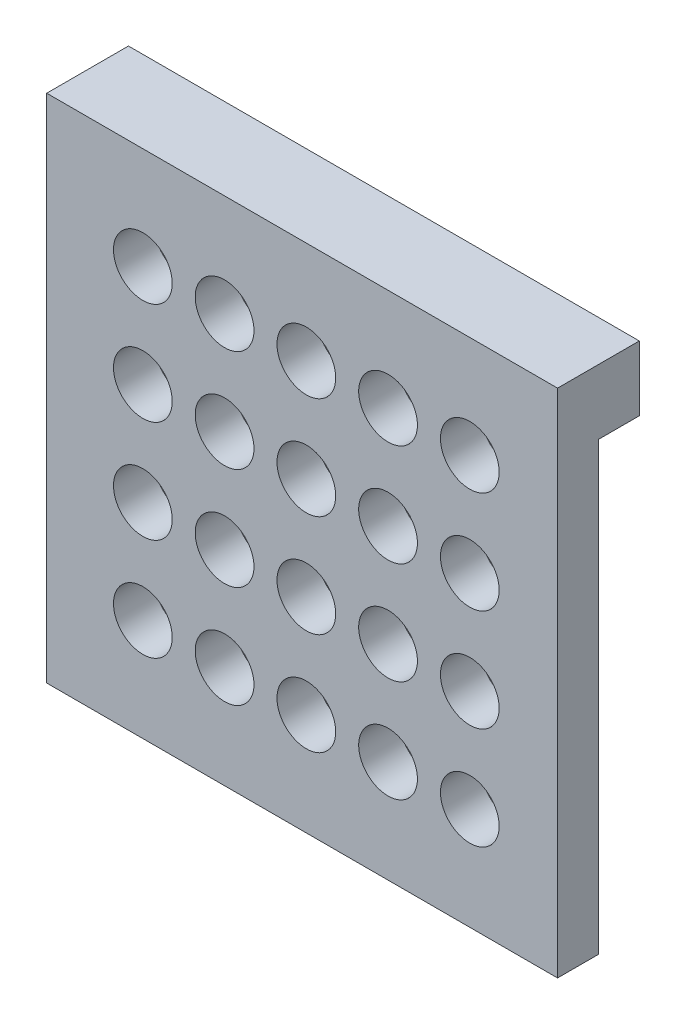
ISO-10303-21;
HEADER;
FILE_DESCRIPTION(('STEP AP214'),'2;1');
FILE_NAME('part.step','',(''),(''),'','','');
FILE_SCHEMA(('AUTOMOTIVE_DESIGN { 1 0 10303 214 1 1 1 1 }'));
ENDSEC;
DATA;
#1=APPLICATION_CONTEXT('core data for automotive mechanical design processes');
#2=APPLICATION_PROTOCOL_DEFINITION('international standard','automotive_design',2000,#1);
#3=PRODUCT_CONTEXT('',#1,'mechanical');
#4=PRODUCT('Part','Part','',(#3));
#5=PRODUCT_RELATED_PRODUCT_CATEGORY('part','',(#4));
#6=PRODUCT_DEFINITION_FORMATION('','',#4);
#7=PRODUCT_DEFINITION_CONTEXT('part definition',#1,'design');
#8=PRODUCT_DEFINITION('design','',#6,#7);
#9=PRODUCT_DEFINITION_SHAPE('','',#8);
#10=(LENGTH_UNIT() NAMED_UNIT(*) SI_UNIT(.MILLI.,.METRE.));
#11=(NAMED_UNIT(*) PLANE_ANGLE_UNIT() SI_UNIT($,.RADIAN.));
#12=(NAMED_UNIT(*) SI_UNIT($,.STERADIAN.) SOLID_ANGLE_UNIT());
#13=UNCERTAINTY_MEASURE_WITH_UNIT(LENGTH_MEASURE(1.E-05),#10,'distance_accuracy_value','');
#14=(GEOMETRIC_REPRESENTATION_CONTEXT(3) GLOBAL_UNCERTAINTY_ASSIGNED_CONTEXT((#13)) GLOBAL_UNIT_ASSIGNED_CONTEXT((#10,
#11,#12)) REPRESENTATION_CONTEXT('',''));
#15=CARTESIAN_POINT('',(0.,0.,0.));
#16=DIRECTION('',(0.,0.,1.));
#17=DIRECTION('',(1.,0.,0.));
#18=AXIS2_PLACEMENT_3D('',#15,#16,#17);
#19=CARTESIAN_POINT('',(0.,0.,4.));
#20=DIRECTION('',(1.,0.,0.));
#21=DIRECTION('',(0.,0.,-1.));
#22=AXIS2_PLACEMENT_3D('',#19,#20,#21);
#23=PLANE('',#22);
#24=DIRECTION('',(0.,0.,-1.));
#25=VECTOR('',#24,1.);
#26=CARTESIAN_POINT('',(0.,50.,4.));
#27=LINE('',#26,#25);
#28=CARTESIAN_POINT('',(0.,50.,4.));
#29=VERTEX_POINT('',#28);
#30=CARTESIAN_POINT('',(0.,50.,-4.));
#31=VERTEX_POINT('',#30);
#32=EDGE_CURVE('E246',#29,#31,#27,.T.);
#33=ORIENTED_EDGE('',*,*,#32,.T.);
#34=DIRECTION('',(0.,1.,0.));
#35=VECTOR('',#34,1.);
#36=CARTESIAN_POINT('',(0.,50.,-4.));
#37=LINE('',#36,#35);
#38=CARTESIAN_POINT('',(0.,43.6517328811306,-4.));
#39=VERTEX_POINT('',#38);
#40=EDGE_CURVE('E102',#39,#31,#37,.T.);
#41=ORIENTED_EDGE('',*,*,#40,.F.);
#42=DIRECTION('',(0.,0.,1.));
#43=VECTOR('',#42,1.);
#44=CARTESIAN_POINT('',(0.,43.6517328811306,-4.));
#45=LINE('',#44,#43);
#46=CARTESIAN_POINT('',(0.,43.6517328811306,0.));
#47=VERTEX_POINT('',#46);
#48=EDGE_CURVE('E98',#39,#47,#45,.T.);
#49=ORIENTED_EDGE('',*,*,#48,.T.);
#50=DIRECTION('',(0.,-1.,0.));
#51=VECTOR('',#50,1.);
#52=CARTESIAN_POINT('',(0.,0.,0.));
#53=LINE('',#52,#51);
#54=CARTESIAN_POINT('',(0.,0.,0.));
#55=VERTEX_POINT('',#54);
#56=EDGE_CURVE('E237',#47,#55,#53,.T.);
#57=ORIENTED_EDGE('',*,*,#56,.T.);
#58=DIRECTION('',(0.,0.,-1.));
#59=VECTOR('',#58,1.);
#60=CARTESIAN_POINT('',(0.,0.,4.));
#61=LINE('',#60,#59);
#62=CARTESIAN_POINT('',(0.,0.,4.));
#63=VERTEX_POINT('',#62);
#64=EDGE_CURVE('E11',#63,#55,#61,.T.);
#65=ORIENTED_EDGE('',*,*,#64,.F.);
#66=DIRECTION('',(0.,-1.,0.));
#67=VECTOR('',#66,1.);
#68=CARTESIAN_POINT('',(0.,0.,4.));
#69=LINE('',#68,#67);
#70=EDGE_CURVE('E240',#29,#63,#69,.T.);
#71=ORIENTED_EDGE('',*,*,#70,.F.);
#72=EDGE_LOOP('',(#33,#41,#49,#57,#65,#71));
#73=FACE_BOUND('',#72,.T.);
#74=ADVANCED_FACE('F32',(#73),#23,.F.);
#75=CARTESIAN_POINT('',(0.,0.,4.));
#76=DIRECTION('',(0.,1.,0.));
#77=DIRECTION('',(0.,0.,1.));
#78=AXIS2_PLACEMENT_3D('',#75,#76,#77);
#79=PLANE('',#78);
#80=DIRECTION('',(1.,0.,0.));
#81=VECTOR('',#80,1.);
#82=CARTESIAN_POINT('',(0.,0.,0.));
#83=LINE('',#82,#81);
#84=CARTESIAN_POINT('',(50.,0.,0.));
#85=VERTEX_POINT('',#84);
#86=EDGE_CURVE('E70',#55,#85,#83,.T.);
#87=ORIENTED_EDGE('',*,*,#86,.T.);
#88=DIRECTION('',(0.,0.,-1.));
#89=VECTOR('',#88,1.);
#90=CARTESIAN_POINT('',(50.,0.,4.));
#91=LINE('',#90,#89);
#92=CARTESIAN_POINT('',(50.,0.,4.));
#93=VERTEX_POINT('',#92);
#94=EDGE_CURVE('E39',#93,#85,#91,.T.);
#95=ORIENTED_EDGE('',*,*,#94,.F.);
#96=DIRECTION('',(1.,0.,0.));
#97=VECTOR('',#96,1.);
#98=CARTESIAN_POINT('',(0.,0.,4.));
#99=LINE('',#98,#97);
#100=EDGE_CURVE('E75',#63,#93,#99,.T.);
#101=ORIENTED_EDGE('',*,*,#100,.F.);
#102=ORIENTED_EDGE('',*,*,#64,.T.);
#103=EDGE_LOOP('',(#87,#95,#101,#102));
#104=FACE_BOUND('',#103,.T.);
#105=ADVANCED_FACE('F256',(#104),#79,.F.);
#106=CARTESIAN_POINT('',(50.,0.,4.));
#107=DIRECTION('',(-1.,0.,0.));
#108=DIRECTION('',(0.,0.,1.));
#109=AXIS2_PLACEMENT_3D('',#106,#107,#108);
#110=PLANE('',#109);
#111=DIRECTION('',(0.,1.,0.));
#112=VECTOR('',#111,1.);
#113=CARTESIAN_POINT('',(50.,0.,0.));
#114=LINE('',#113,#112);
#115=CARTESIAN_POINT('',(50.,43.6517328811306,0.));
#116=VERTEX_POINT('',#115);
#117=EDGE_CURVE('E114',#85,#116,#114,.T.);
#118=ORIENTED_EDGE('',*,*,#117,.T.);
#119=DIRECTION('',(0.,0.,1.));
#120=VECTOR('',#119,1.);
#121=CARTESIAN_POINT('',(50.,43.6517328811306,-4.));
#122=LINE('',#121,#120);
#123=CARTESIAN_POINT('',(50.,43.6517328811306,-4.));
#124=VERTEX_POINT('',#123);
#125=EDGE_CURVE('E96',#124,#116,#122,.T.);
#126=ORIENTED_EDGE('',*,*,#125,.F.);
#127=DIRECTION('',(0.,-1.,0.));
#128=VECTOR('',#127,1.);
#129=CARTESIAN_POINT('',(50.,50.,-4.));
#130=LINE('',#129,#128);
#131=CARTESIAN_POINT('',(50.,50.,-4.));
#132=VERTEX_POINT('',#131);
#133=EDGE_CURVE('E103',#132,#124,#130,.T.);
#134=ORIENTED_EDGE('',*,*,#133,.F.);
#135=DIRECTION('',(0.,0.,-1.));
#136=VECTOR('',#135,1.);
#137=CARTESIAN_POINT('',(50.,50.,4.));
#138=LINE('',#137,#136);
#139=CARTESIAN_POINT('',(50.,50.,4.));
#140=VERTEX_POINT('',#139);
#141=EDGE_CURVE('E251',#140,#132,#138,.T.);
#142=ORIENTED_EDGE('',*,*,#141,.F.);
#143=DIRECTION('',(0.,1.,0.));
#144=VECTOR('',#143,1.);
#145=CARTESIAN_POINT('',(50.,0.,4.));
#146=LINE('',#145,#144);
#147=EDGE_CURVE('E243',#93,#140,#146,.T.);
#148=ORIENTED_EDGE('',*,*,#147,.F.);
#149=ORIENTED_EDGE('',*,*,#94,.T.);
#150=EDGE_LOOP('',(#118,#126,#134,#142,#148,#149));
#151=FACE_BOUND('',#150,.T.);
#152=ADVANCED_FACE('F113',(#151),#110,.F.);
#153=CARTESIAN_POINT('',(0.,50.,4.));
#154=DIRECTION('',(0.,-1.,0.));
#155=DIRECTION('',(0.,0.,-1.));
#156=AXIS2_PLACEMENT_3D('',#153,#154,#155);
#157=PLANE('',#156);
#158=ORIENTED_EDGE('',*,*,#141,.T.);
#159=DIRECTION('',(1.,0.,0.));
#160=VECTOR('',#159,1.);
#161=CARTESIAN_POINT('',(50.,50.,-4.));
#162=LINE('',#161,#160);
#163=EDGE_CURVE('E109',#31,#132,#162,.T.);
#164=ORIENTED_EDGE('',*,*,#163,.F.);
#165=ORIENTED_EDGE('',*,*,#32,.F.);
#166=DIRECTION('',(-1.,0.,0.));
#167=VECTOR('',#166,1.);
#168=CARTESIAN_POINT('',(0.,50.,4.));
#169=LINE('',#168,#167);
#170=EDGE_CURVE('E55',#140,#29,#169,.T.);
#171=ORIENTED_EDGE('',*,*,#170,.F.);
#172=EDGE_LOOP('',(#158,#164,#165,#171));
#173=FACE_BOUND('',#172,.T.);
#174=ADVANCED_FACE('F262',(#173),#157,.F.);
#175=CARTESIAN_POINT('',(0.,0.,4.));
#176=DIRECTION('',(0.,0.,-1.));
#177=DIRECTION('',(-1.,0.,0.));
#178=AXIS2_PLACEMENT_3D('',#175,#176,#177);
#179=PLANE('',#178);
#180=CARTESIAN_POINT('',(9.41089603938606,10.0097791512671,4.));
#181=DIRECTION('',(0.,0.,1.));
#182=DIRECTION('',(1.,0.,0.));
#183=AXIS2_PLACEMENT_3D('',#180,#181,#182);
#184=CIRCLE('',#183,2.87499818107141);
#185=CARTESIAN_POINT('',(12.2858942204575,10.0097791512671,4.));
#186=VERTEX_POINT('',#185);
#187=EDGE_CURVE('E115',#186,#186,#184,.T.);
#188=ORIENTED_EDGE('',*,*,#187,.F.);
#189=EDGE_LOOP('',(#188));
#190=FACE_BOUND('',#189,.T.);
#191=CARTESIAN_POINT('',(9.41089603938596,20.0097791512671,4.));
#192=DIRECTION('',(0.,0.,1.));
#193=DIRECTION('',(1.,0.,0.));
#194=AXIS2_PLACEMENT_3D('',#191,#192,#193);
#195=CIRCLE('',#194,2.87499818107141);
#196=CARTESIAN_POINT('',(12.2858942204574,20.0097791512671,4.));
#197=VERTEX_POINT('',#196);
#198=EDGE_CURVE('E229',#197,#197,#195,.T.);
#199=ORIENTED_EDGE('',*,*,#198,.F.);
#200=EDGE_LOOP('',(#199));
#201=FACE_BOUND('',#200,.T.);
#202=CARTESIAN_POINT('',(9.41089603938585,30.0097791512671,4.));
#203=DIRECTION('',(0.,0.,1.));
#204=DIRECTION('',(1.,0.,0.));
#205=AXIS2_PLACEMENT_3D('',#202,#203,#204);
#206=CIRCLE('',#205,2.87499818107141);
#207=CARTESIAN_POINT('',(12.2858942204573,30.0097791512671,4.));
#208=VERTEX_POINT('',#207);
#209=EDGE_CURVE('E223',#208,#208,#206,.T.);
#210=ORIENTED_EDGE('',*,*,#209,.F.);
#211=EDGE_LOOP('',(#210));
#212=FACE_BOUND('',#211,.T.);
#213=CARTESIAN_POINT('',(41.4108960393861,10.0097791512671,4.));
#214=DIRECTION('',(0.,0.,1.));
#215=DIRECTION('',(1.,0.,0.));
#216=AXIS2_PLACEMENT_3D('',#213,#214,#215);
#217=CIRCLE('',#216,2.87499818107141);
#218=CARTESIAN_POINT('',(44.2858942204575,10.0097791512671,4.));
#219=VERTEX_POINT('',#218);
#220=EDGE_CURVE('E217',#219,#219,#217,.T.);
#221=ORIENTED_EDGE('',*,*,#220,.F.);
#222=EDGE_LOOP('',(#221));
#223=FACE_BOUND('',#222,.T.);
#224=CARTESIAN_POINT('',(33.4108960393861,10.0097791512671,4.));
#225=DIRECTION('',(0.,0.,1.));
#226=DIRECTION('',(1.,0.,0.));
#227=AXIS2_PLACEMENT_3D('',#224,#225,#226);
#228=CIRCLE('',#227,2.87499818107141);
#229=CARTESIAN_POINT('',(36.2858942204575,10.0097791512671,4.));
#230=VERTEX_POINT('',#229);
#231=EDGE_CURVE('E211',#230,#230,#228,.T.);
#232=ORIENTED_EDGE('',*,*,#231,.F.);
#233=EDGE_LOOP('',(#232));
#234=FACE_BOUND('',#233,.T.);
#235=CARTESIAN_POINT('',(25.4108960393861,10.0097791512671,4.));
#236=DIRECTION('',(0.,0.,1.));
#237=DIRECTION('',(1.,0.,0.));
#238=AXIS2_PLACEMENT_3D('',#235,#236,#237);
#239=CIRCLE('',#238,2.87499818107141);
#240=CARTESIAN_POINT('',(28.2858942204575,10.0097791512671,4.));
#241=VERTEX_POINT('',#240);
#242=EDGE_CURVE('E205',#241,#241,#239,.T.);
#243=ORIENTED_EDGE('',*,*,#242,.F.);
#244=EDGE_LOOP('',(#243));
#245=FACE_BOUND('',#244,.T.);
#246=CARTESIAN_POINT('',(17.4108960393861,10.0097791512671,4.));
#247=DIRECTION('',(0.,0.,1.));
#248=DIRECTION('',(1.,0.,0.));
#249=AXIS2_PLACEMENT_3D('',#246,#247,#248);
#250=CIRCLE('',#249,2.87499818107141);
#251=CARTESIAN_POINT('',(20.2858942204575,10.0097791512671,4.));
#252=VERTEX_POINT('',#251);
#253=EDGE_CURVE('E199',#252,#252,#250,.T.);
#254=ORIENTED_EDGE('',*,*,#253,.F.);
#255=EDGE_LOOP('',(#254));
#256=FACE_BOUND('',#255,.T.);
#257=CARTESIAN_POINT('',(41.410896039386,20.0097791512671,4.));
#258=DIRECTION('',(0.,0.,1.));
#259=DIRECTION('',(1.,0.,0.));
#260=AXIS2_PLACEMENT_3D('',#257,#258,#259);
#261=CIRCLE('',#260,2.87499818107141);
#262=CARTESIAN_POINT('',(44.2858942204574,20.0097791512671,4.));
#263=VERTEX_POINT('',#262);
#264=EDGE_CURVE('E193',#263,#263,#261,.T.);
#265=ORIENTED_EDGE('',*,*,#264,.F.);
#266=EDGE_LOOP('',(#265));
#267=FACE_BOUND('',#266,.T.);
#268=CARTESIAN_POINT('',(33.410896039386,20.0097791512671,4.));
#269=DIRECTION('',(0.,0.,1.));
#270=DIRECTION('',(1.,0.,0.));
#271=AXIS2_PLACEMENT_3D('',#268,#269,#270);
#272=CIRCLE('',#271,2.87499818107141);
#273=CARTESIAN_POINT('',(36.2858942204574,20.0097791512671,4.));
#274=VERTEX_POINT('',#273);
#275=EDGE_CURVE('E187',#274,#274,#272,.T.);
#276=ORIENTED_EDGE('',*,*,#275,.F.);
#277=EDGE_LOOP('',(#276));
#278=FACE_BOUND('',#277,.T.);
#279=CARTESIAN_POINT('',(25.410896039386,20.0097791512671,4.));
#280=DIRECTION('',(0.,0.,1.));
#281=DIRECTION('',(1.,0.,0.));
#282=AXIS2_PLACEMENT_3D('',#279,#280,#281);
#283=CIRCLE('',#282,2.87499818107141);
#284=CARTESIAN_POINT('',(28.2858942204574,20.0097791512671,4.));
#285=VERTEX_POINT('',#284);
#286=EDGE_CURVE('E181',#285,#285,#283,.T.);
#287=ORIENTED_EDGE('',*,*,#286,.F.);
#288=EDGE_LOOP('',(#287));
#289=FACE_BOUND('',#288,.T.);
#290=CARTESIAN_POINT('',(17.410896039386,20.0097791512671,4.));
#291=DIRECTION('',(0.,0.,1.));
#292=DIRECTION('',(1.,0.,0.));
#293=AXIS2_PLACEMENT_3D('',#290,#291,#292);
#294=CIRCLE('',#293,2.87499818107141);
#295=CARTESIAN_POINT('',(20.2858942204574,20.0097791512671,4.));
#296=VERTEX_POINT('',#295);
#297=EDGE_CURVE('E175',#296,#296,#294,.T.);
#298=ORIENTED_EDGE('',*,*,#297,.F.);
#299=EDGE_LOOP('',(#298));
#300=FACE_BOUND('',#299,.T.);
#301=CARTESIAN_POINT('',(41.4108960393859,30.0097791512671,4.));
#302=DIRECTION('',(0.,0.,1.));
#303=DIRECTION('',(1.,0.,0.));
#304=AXIS2_PLACEMENT_3D('',#301,#302,#303);
#305=CIRCLE('',#304,2.87499818107141);
#306=CARTESIAN_POINT('',(44.2858942204573,30.0097791512671,4.));
#307=VERTEX_POINT('',#306);
#308=EDGE_CURVE('E169',#307,#307,#305,.T.);
#309=ORIENTED_EDGE('',*,*,#308,.F.);
#310=EDGE_LOOP('',(#309));
#311=FACE_BOUND('',#310,.T.);
#312=CARTESIAN_POINT('',(33.4108960393859,30.0097791512671,4.));
#313=DIRECTION('',(0.,0.,1.));
#314=DIRECTION('',(1.,0.,0.));
#315=AXIS2_PLACEMENT_3D('',#312,#313,#314);
#316=CIRCLE('',#315,2.87499818107141);
#317=CARTESIAN_POINT('',(36.2858942204573,30.0097791512671,4.));
#318=VERTEX_POINT('',#317);
#319=EDGE_CURVE('E163',#318,#318,#316,.T.);
#320=ORIENTED_EDGE('',*,*,#319,.F.);
#321=EDGE_LOOP('',(#320));
#322=FACE_BOUND('',#321,.T.);
#323=CARTESIAN_POINT('',(25.4108960393859,30.0097791512671,4.));
#324=DIRECTION('',(0.,0.,1.));
#325=DIRECTION('',(1.,0.,0.));
#326=AXIS2_PLACEMENT_3D('',#323,#324,#325);
#327=CIRCLE('',#326,2.87499818107141);
#328=CARTESIAN_POINT('',(28.2858942204573,30.0097791512671,4.));
#329=VERTEX_POINT('',#328);
#330=EDGE_CURVE('E157',#329,#329,#327,.T.);
#331=ORIENTED_EDGE('',*,*,#330,.F.);
#332=EDGE_LOOP('',(#331));
#333=FACE_BOUND('',#332,.T.);
#334=CARTESIAN_POINT('',(17.4108960393859,30.0097791512671,4.));
#335=DIRECTION('',(0.,0.,1.));
#336=DIRECTION('',(1.,0.,0.));
#337=AXIS2_PLACEMENT_3D('',#334,#335,#336);
#338=CIRCLE('',#337,2.87499818107141);
#339=CARTESIAN_POINT('',(20.2858942204573,30.0097791512671,4.));
#340=VERTEX_POINT('',#339);
#341=EDGE_CURVE('E151',#340,#340,#338,.T.);
#342=ORIENTED_EDGE('',*,*,#341,.F.);
#343=EDGE_LOOP('',(#342));
#344=FACE_BOUND('',#343,.T.);
#345=CARTESIAN_POINT('',(41.4108960393857,40.0097791512671,4.));
#346=DIRECTION('',(0.,0.,1.));
#347=DIRECTION('',(1.,0.,0.));
#348=AXIS2_PLACEMENT_3D('',#345,#346,#347);
#349=CIRCLE('',#348,2.87499818107141);
#350=CARTESIAN_POINT('',(44.2858942204572,40.0097791512671,4.));
#351=VERTEX_POINT('',#350);
#352=EDGE_CURVE('E145',#351,#351,#349,.T.);
#353=ORIENTED_EDGE('',*,*,#352,.F.);
#354=EDGE_LOOP('',(#353));
#355=FACE_BOUND('',#354,.T.);
#356=CARTESIAN_POINT('',(33.4108960393857,40.0097791512671,4.));
#357=DIRECTION('',(0.,0.,1.));
#358=DIRECTION('',(1.,0.,0.));
#359=AXIS2_PLACEMENT_3D('',#356,#357,#358);
#360=CIRCLE('',#359,2.87499818107141);
#361=CARTESIAN_POINT('',(36.2858942204572,40.0097791512671,4.));
#362=VERTEX_POINT('',#361);
#363=EDGE_CURVE('E139',#362,#362,#360,.T.);
#364=ORIENTED_EDGE('',*,*,#363,.F.);
#365=EDGE_LOOP('',(#364));
#366=FACE_BOUND('',#365,.T.);
#367=CARTESIAN_POINT('',(25.4108960393857,40.0097791512671,4.));
#368=DIRECTION('',(0.,0.,1.));
#369=DIRECTION('',(1.,0.,0.));
#370=AXIS2_PLACEMENT_3D('',#367,#368,#369);
#371=CIRCLE('',#370,2.87499818107141);
#372=CARTESIAN_POINT('',(28.2858942204572,40.0097791512671,4.));
#373=VERTEX_POINT('',#372);
#374=EDGE_CURVE('E133',#373,#373,#371,.T.);
#375=ORIENTED_EDGE('',*,*,#374,.F.);
#376=EDGE_LOOP('',(#375));
#377=FACE_BOUND('',#376,.T.);
#378=CARTESIAN_POINT('',(17.4108960393857,40.0097791512671,4.));
#379=DIRECTION('',(0.,0.,1.));
#380=DIRECTION('',(1.,0.,0.));
#381=AXIS2_PLACEMENT_3D('',#378,#379,#380);
#382=CIRCLE('',#381,2.87499818107141);
#383=CARTESIAN_POINT('',(20.2858942204572,40.0097791512671,4.));
#384=VERTEX_POINT('',#383);
#385=EDGE_CURVE('E127',#384,#384,#382,.T.);
#386=ORIENTED_EDGE('',*,*,#385,.F.);
#387=EDGE_LOOP('',(#386));
#388=FACE_BOUND('',#387,.T.);
#389=CARTESIAN_POINT('',(9.41089603938575,40.0097791512671,4.));
#390=DIRECTION('',(0.,0.,1.));
#391=DIRECTION('',(1.,0.,0.));
#392=AXIS2_PLACEMENT_3D('',#389,#390,#391);
#393=CIRCLE('',#392,2.87499818107141);
#394=CARTESIAN_POINT('',(12.2858942204572,40.0097791512671,4.));
#395=VERTEX_POINT('',#394);
#396=EDGE_CURVE('E126',#395,#395,#393,.T.);
#397=ORIENTED_EDGE('',*,*,#396,.F.);
#398=EDGE_LOOP('',(#397));
#399=FACE_BOUND('',#398,.T.);
#400=ORIENTED_EDGE('',*,*,#70,.T.);
#401=ORIENTED_EDGE('',*,*,#100,.T.);
#402=ORIENTED_EDGE('',*,*,#147,.T.);
#403=ORIENTED_EDGE('',*,*,#170,.T.);
#404=EDGE_LOOP('',(#400,#401,#402,#403));
#405=FACE_BOUND('',#404,.T.);
#406=ADVANCED_FACE('F264',(#190,#201,#212,#223,#234,#245,#256,#267,#278,#289,#300,#311,#322,
#333,#344,#355,#366,#377,#388,#399,#405),#179,.F.);
#407=CARTESIAN_POINT('',(0.,0.,0.));
#408=DIRECTION('',(0.,0.,-1.));
#409=DIRECTION('',(-1.,0.,0.));
#410=AXIS2_PLACEMENT_3D('',#407,#408,#409);
#411=PLANE('',#410);
#412=DIRECTION('',(-1.,0.,0.));
#413=VECTOR('',#412,1.);
#414=CARTESIAN_POINT('',(50.,43.6517328811306,0.));
#415=LINE('',#414,#413);
#416=EDGE_CURVE('E46',#116,#47,#415,.T.);
#417=ORIENTED_EDGE('',*,*,#416,.F.);
#418=ORIENTED_EDGE('',*,*,#117,.F.);
#419=ORIENTED_EDGE('',*,*,#86,.F.);
#420=ORIENTED_EDGE('',*,*,#56,.F.);
#421=EDGE_LOOP('',(#417,#418,#419,#420));
#422=FACE_BOUND('',#421,.T.);
#423=CARTESIAN_POINT('',(9.41089603938606,10.0097791512671,0.));
#424=DIRECTION('',(0.,0.,1.));
#425=DIRECTION('',(1.,0.,0.));
#426=AXIS2_PLACEMENT_3D('',#423,#424,#425);
#427=CIRCLE('',#426,2.87499818107141);
#428=CARTESIAN_POINT('',(12.2858942204575,10.0097791512671,0.));
#429=VERTEX_POINT('',#428);
#430=EDGE_CURVE('E118',#429,#429,#427,.T.);
#431=ORIENTED_EDGE('',*,*,#430,.T.);
#432=EDGE_LOOP('',(#431));
#433=FACE_BOUND('',#432,.T.);
#434=CARTESIAN_POINT('',(9.41089603938596,20.0097791512671,0.));
#435=DIRECTION('',(0.,0.,1.));
#436=DIRECTION('',(1.,0.,0.));
#437=AXIS2_PLACEMENT_3D('',#434,#435,#436);
#438=CIRCLE('',#437,2.87499818107141);
#439=CARTESIAN_POINT('',(12.2858942204574,20.0097791512671,0.));
#440=VERTEX_POINT('',#439);
#441=EDGE_CURVE('E226',#440,#440,#438,.T.);
#442=ORIENTED_EDGE('',*,*,#441,.T.);
#443=EDGE_LOOP('',(#442));
#444=FACE_BOUND('',#443,.T.);
#445=CARTESIAN_POINT('',(9.41089603938585,30.0097791512671,0.));
#446=DIRECTION('',(0.,0.,1.));
#447=DIRECTION('',(1.,0.,0.));
#448=AXIS2_PLACEMENT_3D('',#445,#446,#447);
#449=CIRCLE('',#448,2.87499818107141);
#450=CARTESIAN_POINT('',(12.2858942204573,30.0097791512671,0.));
#451=VERTEX_POINT('',#450);
#452=EDGE_CURVE('E220',#451,#451,#449,.T.);
#453=ORIENTED_EDGE('',*,*,#452,.T.);
#454=EDGE_LOOP('',(#453));
#455=FACE_BOUND('',#454,.T.);
#456=CARTESIAN_POINT('',(41.4108960393861,10.0097791512671,0.));
#457=DIRECTION('',(0.,0.,1.));
#458=DIRECTION('',(1.,0.,0.));
#459=AXIS2_PLACEMENT_3D('',#456,#457,#458);
#460=CIRCLE('',#459,2.87499818107141);
#461=CARTESIAN_POINT('',(44.2858942204575,10.0097791512671,0.));
#462=VERTEX_POINT('',#461);
#463=EDGE_CURVE('E214',#462,#462,#460,.T.);
#464=ORIENTED_EDGE('',*,*,#463,.T.);
#465=EDGE_LOOP('',(#464));
#466=FACE_BOUND('',#465,.T.);
#467=CARTESIAN_POINT('',(33.4108960393861,10.0097791512671,0.));
#468=DIRECTION('',(0.,0.,1.));
#469=DIRECTION('',(1.,0.,0.));
#470=AXIS2_PLACEMENT_3D('',#467,#468,#469);
#471=CIRCLE('',#470,2.87499818107141);
#472=CARTESIAN_POINT('',(36.2858942204575,10.0097791512671,0.));
#473=VERTEX_POINT('',#472);
#474=EDGE_CURVE('E208',#473,#473,#471,.T.);
#475=ORIENTED_EDGE('',*,*,#474,.T.);
#476=EDGE_LOOP('',(#475));
#477=FACE_BOUND('',#476,.T.);
#478=CARTESIAN_POINT('',(25.4108960393861,10.0097791512671,0.));
#479=DIRECTION('',(0.,0.,1.));
#480=DIRECTION('',(1.,0.,0.));
#481=AXIS2_PLACEMENT_3D('',#478,#479,#480);
#482=CIRCLE('',#481,2.87499818107141);
#483=CARTESIAN_POINT('',(28.2858942204575,10.0097791512671,0.));
#484=VERTEX_POINT('',#483);
#485=EDGE_CURVE('E202',#484,#484,#482,.T.);
#486=ORIENTED_EDGE('',*,*,#485,.T.);
#487=EDGE_LOOP('',(#486));
#488=FACE_BOUND('',#487,.T.);
#489=CARTESIAN_POINT('',(17.4108960393861,10.0097791512671,0.));
#490=DIRECTION('',(0.,0.,1.));
#491=DIRECTION('',(1.,0.,0.));
#492=AXIS2_PLACEMENT_3D('',#489,#490,#491);
#493=CIRCLE('',#492,2.87499818107141);
#494=CARTESIAN_POINT('',(20.2858942204575,10.0097791512671,0.));
#495=VERTEX_POINT('',#494);
#496=EDGE_CURVE('E196',#495,#495,#493,.T.);
#497=ORIENTED_EDGE('',*,*,#496,.T.);
#498=EDGE_LOOP('',(#497));
#499=FACE_BOUND('',#498,.T.);
#500=CARTESIAN_POINT('',(41.410896039386,20.0097791512671,0.));
#501=DIRECTION('',(0.,0.,1.));
#502=DIRECTION('',(1.,0.,0.));
#503=AXIS2_PLACEMENT_3D('',#500,#501,#502);
#504=CIRCLE('',#503,2.87499818107141);
#505=CARTESIAN_POINT('',(44.2858942204574,20.0097791512671,0.));
#506=VERTEX_POINT('',#505);
#507=EDGE_CURVE('E190',#506,#506,#504,.T.);
#508=ORIENTED_EDGE('',*,*,#507,.T.);
#509=EDGE_LOOP('',(#508));
#510=FACE_BOUND('',#509,.T.);
#511=CARTESIAN_POINT('',(33.410896039386,20.0097791512671,0.));
#512=DIRECTION('',(0.,0.,1.));
#513=DIRECTION('',(1.,0.,0.));
#514=AXIS2_PLACEMENT_3D('',#511,#512,#513);
#515=CIRCLE('',#514,2.87499818107141);
#516=CARTESIAN_POINT('',(36.2858942204574,20.0097791512671,0.));
#517=VERTEX_POINT('',#516);
#518=EDGE_CURVE('E184',#517,#517,#515,.T.);
#519=ORIENTED_EDGE('',*,*,#518,.T.);
#520=EDGE_LOOP('',(#519));
#521=FACE_BOUND('',#520,.T.);
#522=CARTESIAN_POINT('',(25.410896039386,20.0097791512671,0.));
#523=DIRECTION('',(0.,0.,1.));
#524=DIRECTION('',(1.,0.,0.));
#525=AXIS2_PLACEMENT_3D('',#522,#523,#524);
#526=CIRCLE('',#525,2.87499818107141);
#527=CARTESIAN_POINT('',(28.2858942204574,20.0097791512671,0.));
#528=VERTEX_POINT('',#527);
#529=EDGE_CURVE('E178',#528,#528,#526,.T.);
#530=ORIENTED_EDGE('',*,*,#529,.T.);
#531=EDGE_LOOP('',(#530));
#532=FACE_BOUND('',#531,.T.);
#533=CARTESIAN_POINT('',(17.410896039386,20.0097791512671,0.));
#534=DIRECTION('',(0.,0.,1.));
#535=DIRECTION('',(1.,0.,0.));
#536=AXIS2_PLACEMENT_3D('',#533,#534,#535);
#537=CIRCLE('',#536,2.87499818107141);
#538=CARTESIAN_POINT('',(20.2858942204574,20.0097791512671,0.));
#539=VERTEX_POINT('',#538);
#540=EDGE_CURVE('E172',#539,#539,#537,.T.);
#541=ORIENTED_EDGE('',*,*,#540,.T.);
#542=EDGE_LOOP('',(#541));
#543=FACE_BOUND('',#542,.T.);
#544=CARTESIAN_POINT('',(41.4108960393859,30.0097791512671,0.));
#545=DIRECTION('',(0.,0.,1.));
#546=DIRECTION('',(1.,0.,0.));
#547=AXIS2_PLACEMENT_3D('',#544,#545,#546);
#548=CIRCLE('',#547,2.87499818107141);
#549=CARTESIAN_POINT('',(44.2858942204573,30.0097791512671,0.));
#550=VERTEX_POINT('',#549);
#551=EDGE_CURVE('E166',#550,#550,#548,.T.);
#552=ORIENTED_EDGE('',*,*,#551,.T.);
#553=EDGE_LOOP('',(#552));
#554=FACE_BOUND('',#553,.T.);
#555=CARTESIAN_POINT('',(33.4108960393859,30.0097791512671,0.));
#556=DIRECTION('',(0.,0.,1.));
#557=DIRECTION('',(1.,0.,0.));
#558=AXIS2_PLACEMENT_3D('',#555,#556,#557);
#559=CIRCLE('',#558,2.87499818107141);
#560=CARTESIAN_POINT('',(36.2858942204573,30.0097791512671,0.));
#561=VERTEX_POINT('',#560);
#562=EDGE_CURVE('E160',#561,#561,#559,.T.);
#563=ORIENTED_EDGE('',*,*,#562,.T.);
#564=EDGE_LOOP('',(#563));
#565=FACE_BOUND('',#564,.T.);
#566=CARTESIAN_POINT('',(25.4108960393859,30.0097791512671,0.));
#567=DIRECTION('',(0.,0.,1.));
#568=DIRECTION('',(1.,0.,0.));
#569=AXIS2_PLACEMENT_3D('',#566,#567,#568);
#570=CIRCLE('',#569,2.87499818107141);
#571=CARTESIAN_POINT('',(28.2858942204573,30.0097791512671,0.));
#572=VERTEX_POINT('',#571);
#573=EDGE_CURVE('E154',#572,#572,#570,.T.);
#574=ORIENTED_EDGE('',*,*,#573,.T.);
#575=EDGE_LOOP('',(#574));
#576=FACE_BOUND('',#575,.T.);
#577=CARTESIAN_POINT('',(17.4108960393859,30.0097791512671,0.));
#578=DIRECTION('',(0.,0.,1.));
#579=DIRECTION('',(1.,0.,0.));
#580=AXIS2_PLACEMENT_3D('',#577,#578,#579);
#581=CIRCLE('',#580,2.87499818107141);
#582=CARTESIAN_POINT('',(20.2858942204573,30.0097791512671,0.));
#583=VERTEX_POINT('',#582);
#584=EDGE_CURVE('E148',#583,#583,#581,.T.);
#585=ORIENTED_EDGE('',*,*,#584,.T.);
#586=EDGE_LOOP('',(#585));
#587=FACE_BOUND('',#586,.T.);
#588=CARTESIAN_POINT('',(41.4108960393857,40.0097791512671,0.));
#589=DIRECTION('',(0.,0.,1.));
#590=DIRECTION('',(1.,0.,0.));
#591=AXIS2_PLACEMENT_3D('',#588,#589,#590);
#592=CIRCLE('',#591,2.87499818107141);
#593=CARTESIAN_POINT('',(44.2858942204572,40.0097791512671,0.));
#594=VERTEX_POINT('',#593);
#595=EDGE_CURVE('E142',#594,#594,#592,.T.);
#596=ORIENTED_EDGE('',*,*,#595,.T.);
#597=EDGE_LOOP('',(#596));
#598=FACE_BOUND('',#597,.T.);
#599=CARTESIAN_POINT('',(33.4108960393857,40.0097791512671,0.));
#600=DIRECTION('',(0.,0.,1.));
#601=DIRECTION('',(1.,0.,0.));
#602=AXIS2_PLACEMENT_3D('',#599,#600,#601);
#603=CIRCLE('',#602,2.87499818107141);
#604=CARTESIAN_POINT('',(36.2858942204572,40.0097791512671,0.));
#605=VERTEX_POINT('',#604);
#606=EDGE_CURVE('E136',#605,#605,#603,.T.);
#607=ORIENTED_EDGE('',*,*,#606,.T.);
#608=EDGE_LOOP('',(#607));
#609=FACE_BOUND('',#608,.T.);
#610=CARTESIAN_POINT('',(25.4108960393857,40.0097791512671,0.));
#611=DIRECTION('',(0.,0.,1.));
#612=DIRECTION('',(1.,0.,0.));
#613=AXIS2_PLACEMENT_3D('',#610,#611,#612);
#614=CIRCLE('',#613,2.87499818107141);
#615=CARTESIAN_POINT('',(28.2858942204572,40.0097791512671,0.));
#616=VERTEX_POINT('',#615);
#617=EDGE_CURVE('E130',#616,#616,#614,.T.);
#618=ORIENTED_EDGE('',*,*,#617,.T.);
#619=EDGE_LOOP('',(#618));
#620=FACE_BOUND('',#619,.T.);
#621=CARTESIAN_POINT('',(17.4108960393857,40.0097791512671,0.));
#622=DIRECTION('',(0.,0.,1.));
#623=DIRECTION('',(1.,0.,0.));
#624=AXIS2_PLACEMENT_3D('',#621,#622,#623);
#625=CIRCLE('',#624,2.87499818107141);
#626=CARTESIAN_POINT('',(20.2858942204572,40.0097791512671,0.));
#627=VERTEX_POINT('',#626);
#628=EDGE_CURVE('E123',#627,#627,#625,.T.);
#629=ORIENTED_EDGE('',*,*,#628,.T.);
#630=EDGE_LOOP('',(#629));
#631=FACE_BOUND('',#630,.T.);
#632=CARTESIAN_POINT('',(9.41089603938575,40.0097791512671,0.));
#633=DIRECTION('',(0.,0.,1.));
#634=DIRECTION('',(1.,0.,0.));
#635=AXIS2_PLACEMENT_3D('',#632,#633,#634);
#636=CIRCLE('',#635,2.87499818107141);
#637=CARTESIAN_POINT('',(12.2858942204572,40.0097791512671,0.));
#638=VERTEX_POINT('',#637);
#639=EDGE_CURVE('E234',#638,#638,#636,.T.);
#640=ORIENTED_EDGE('',*,*,#639,.T.);
#641=EDGE_LOOP('',(#640));
#642=FACE_BOUND('',#641,.T.);
#643=ADVANCED_FACE('F253',(#422,#433,#444,#455,#466,#477,#488,#499,#510,#521,#532,#543,#554,
#565,#576,#587,#598,#609,#620,#631,#642),#411,.T.);
#644=CARTESIAN_POINT('',(9.41089603938575,40.0097791512671,0.));
#645=DIRECTION('',(0.,0.,1.));
#646=DIRECTION('',(1.,0.,0.));
#647=AXIS2_PLACEMENT_3D('',#644,#645,#646);
#648=CYLINDRICAL_SURFACE('',#647,2.87499818107141);
#649=ORIENTED_EDGE('',*,*,#639,.F.);
#650=EDGE_LOOP('',(#649));
#651=FACE_BOUND('',#650,.T.);
#652=ORIENTED_EDGE('',*,*,#396,.T.);
#653=EDGE_LOOP('',(#652));
#654=FACE_BOUND('',#653,.T.);
#655=ADVANCED_FACE('F304',(#651,#654),#648,.F.);
#656=CARTESIAN_POINT('',(17.4108960393857,40.0097791512671,0.));
#657=DIRECTION('',(0.,0.,1.));
#658=DIRECTION('',(1.,0.,0.));
#659=AXIS2_PLACEMENT_3D('',#656,#657,#658);
#660=CYLINDRICAL_SURFACE('',#659,2.87499818107141);
#661=ORIENTED_EDGE('',*,*,#628,.F.);
#662=EDGE_LOOP('',(#661));
#663=FACE_BOUND('',#662,.T.);
#664=ORIENTED_EDGE('',*,*,#385,.T.);
#665=EDGE_LOOP('',(#664));
#666=FACE_BOUND('',#665,.T.);
#667=ADVANCED_FACE('F328',(#663,#666),#660,.F.);
#668=CARTESIAN_POINT('',(25.4108960393857,40.0097791512671,0.));
#669=DIRECTION('',(0.,0.,1.));
#670=DIRECTION('',(1.,0.,0.));
#671=AXIS2_PLACEMENT_3D('',#668,#669,#670);
#672=CYLINDRICAL_SURFACE('',#671,2.87499818107141);
#673=ORIENTED_EDGE('',*,*,#617,.F.);
#674=EDGE_LOOP('',(#673));
#675=FACE_BOUND('',#674,.T.);
#676=ORIENTED_EDGE('',*,*,#374,.T.);
#677=EDGE_LOOP('',(#676));
#678=FACE_BOUND('',#677,.T.);
#679=ADVANCED_FACE('F331',(#675,#678),#672,.F.);
#680=CARTESIAN_POINT('',(33.4108960393857,40.0097791512671,0.));
#681=DIRECTION('',(0.,0.,1.));
#682=DIRECTION('',(1.,0.,0.));
#683=AXIS2_PLACEMENT_3D('',#680,#681,#682);
#684=CYLINDRICAL_SURFACE('',#683,2.87499818107141);
#685=ORIENTED_EDGE('',*,*,#606,.F.);
#686=EDGE_LOOP('',(#685));
#687=FACE_BOUND('',#686,.T.);
#688=ORIENTED_EDGE('',*,*,#363,.T.);
#689=EDGE_LOOP('',(#688));
#690=FACE_BOUND('',#689,.T.);
#691=ADVANCED_FACE('F335',(#687,#690),#684,.F.);
#692=CARTESIAN_POINT('',(41.4108960393857,40.0097791512671,0.));
#693=DIRECTION('',(0.,0.,1.));
#694=DIRECTION('',(1.,0.,0.));
#695=AXIS2_PLACEMENT_3D('',#692,#693,#694);
#696=CYLINDRICAL_SURFACE('',#695,2.87499818107141);
#697=ORIENTED_EDGE('',*,*,#595,.F.);
#698=EDGE_LOOP('',(#697));
#699=FACE_BOUND('',#698,.T.);
#700=ORIENTED_EDGE('',*,*,#352,.T.);
#701=EDGE_LOOP('',(#700));
#702=FACE_BOUND('',#701,.T.);
#703=ADVANCED_FACE('F339',(#699,#702),#696,.F.);
#704=CARTESIAN_POINT('',(17.4108960393859,30.0097791512671,0.));
#705=DIRECTION('',(0.,0.,1.));
#706=DIRECTION('',(1.,0.,0.));
#707=AXIS2_PLACEMENT_3D('',#704,#705,#706);
#708=CYLINDRICAL_SURFACE('',#707,2.87499818107141);
#709=ORIENTED_EDGE('',*,*,#584,.F.);
#710=EDGE_LOOP('',(#709));
#711=FACE_BOUND('',#710,.T.);
#712=ORIENTED_EDGE('',*,*,#341,.T.);
#713=EDGE_LOOP('',(#712));
#714=FACE_BOUND('',#713,.T.);
#715=ADVANCED_FACE('F343',(#711,#714),#708,.F.);
#716=CARTESIAN_POINT('',(25.4108960393859,30.0097791512671,0.));
#717=DIRECTION('',(0.,0.,1.));
#718=DIRECTION('',(1.,0.,0.));
#719=AXIS2_PLACEMENT_3D('',#716,#717,#718);
#720=CYLINDRICAL_SURFACE('',#719,2.87499818107141);
#721=ORIENTED_EDGE('',*,*,#573,.F.);
#722=EDGE_LOOP('',(#721));
#723=FACE_BOUND('',#722,.T.);
#724=ORIENTED_EDGE('',*,*,#330,.T.);
#725=EDGE_LOOP('',(#724));
#726=FACE_BOUND('',#725,.T.);
#727=ADVANCED_FACE('F347',(#723,#726),#720,.F.);
#728=CARTESIAN_POINT('',(33.4108960393859,30.0097791512671,0.));
#729=DIRECTION('',(0.,0.,1.));
#730=DIRECTION('',(1.,0.,0.));
#731=AXIS2_PLACEMENT_3D('',#728,#729,#730);
#732=CYLINDRICAL_SURFACE('',#731,2.87499818107141);
#733=ORIENTED_EDGE('',*,*,#562,.F.);
#734=EDGE_LOOP('',(#733));
#735=FACE_BOUND('',#734,.T.);
#736=ORIENTED_EDGE('',*,*,#319,.T.);
#737=EDGE_LOOP('',(#736));
#738=FACE_BOUND('',#737,.T.);
#739=ADVANCED_FACE('F351',(#735,#738),#732,.F.);
#740=CARTESIAN_POINT('',(41.4108960393859,30.0097791512671,0.));
#741=DIRECTION('',(0.,0.,1.));
#742=DIRECTION('',(1.,0.,0.));
#743=AXIS2_PLACEMENT_3D('',#740,#741,#742);
#744=CYLINDRICAL_SURFACE('',#743,2.87499818107141);
#745=ORIENTED_EDGE('',*,*,#551,.F.);
#746=EDGE_LOOP('',(#745));
#747=FACE_BOUND('',#746,.T.);
#748=ORIENTED_EDGE('',*,*,#308,.T.);
#749=EDGE_LOOP('',(#748));
#750=FACE_BOUND('',#749,.T.);
#751=ADVANCED_FACE('F355',(#747,#750),#744,.F.);
#752=CARTESIAN_POINT('',(17.410896039386,20.0097791512671,0.));
#753=DIRECTION('',(0.,0.,1.));
#754=DIRECTION('',(1.,0.,0.));
#755=AXIS2_PLACEMENT_3D('',#752,#753,#754);
#756=CYLINDRICAL_SURFACE('',#755,2.87499818107141);
#757=ORIENTED_EDGE('',*,*,#540,.F.);
#758=EDGE_LOOP('',(#757));
#759=FACE_BOUND('',#758,.T.);
#760=ORIENTED_EDGE('',*,*,#297,.T.);
#761=EDGE_LOOP('',(#760));
#762=FACE_BOUND('',#761,.T.);
#763=ADVANCED_FACE('F359',(#759,#762),#756,.F.);
#764=CARTESIAN_POINT('',(25.410896039386,20.0097791512671,0.));
#765=DIRECTION('',(0.,0.,1.));
#766=DIRECTION('',(1.,0.,0.));
#767=AXIS2_PLACEMENT_3D('',#764,#765,#766);
#768=CYLINDRICAL_SURFACE('',#767,2.87499818107141);
#769=ORIENTED_EDGE('',*,*,#529,.F.);
#770=EDGE_LOOP('',(#769));
#771=FACE_BOUND('',#770,.T.);
#772=ORIENTED_EDGE('',*,*,#286,.T.);
#773=EDGE_LOOP('',(#772));
#774=FACE_BOUND('',#773,.T.);
#775=ADVANCED_FACE('F363',(#771,#774),#768,.F.);
#776=CARTESIAN_POINT('',(33.410896039386,20.0097791512671,0.));
#777=DIRECTION('',(0.,0.,1.));
#778=DIRECTION('',(1.,0.,0.));
#779=AXIS2_PLACEMENT_3D('',#776,#777,#778);
#780=CYLINDRICAL_SURFACE('',#779,2.87499818107141);
#781=ORIENTED_EDGE('',*,*,#518,.F.);
#782=EDGE_LOOP('',(#781));
#783=FACE_BOUND('',#782,.T.);
#784=ORIENTED_EDGE('',*,*,#275,.T.);
#785=EDGE_LOOP('',(#784));
#786=FACE_BOUND('',#785,.T.);
#787=ADVANCED_FACE('F367',(#783,#786),#780,.F.);
#788=CARTESIAN_POINT('',(41.410896039386,20.0097791512671,0.));
#789=DIRECTION('',(0.,0.,1.));
#790=DIRECTION('',(1.,0.,0.));
#791=AXIS2_PLACEMENT_3D('',#788,#789,#790);
#792=CYLINDRICAL_SURFACE('',#791,2.87499818107141);
#793=ORIENTED_EDGE('',*,*,#507,.F.);
#794=EDGE_LOOP('',(#793));
#795=FACE_BOUND('',#794,.T.);
#796=ORIENTED_EDGE('',*,*,#264,.T.);
#797=EDGE_LOOP('',(#796));
#798=FACE_BOUND('',#797,.T.);
#799=ADVANCED_FACE('F371',(#795,#798),#792,.F.);
#800=CARTESIAN_POINT('',(17.4108960393861,10.0097791512671,0.));
#801=DIRECTION('',(0.,0.,1.));
#802=DIRECTION('',(1.,0.,0.));
#803=AXIS2_PLACEMENT_3D('',#800,#801,#802);
#804=CYLINDRICAL_SURFACE('',#803,2.87499818107141);
#805=ORIENTED_EDGE('',*,*,#496,.F.);
#806=EDGE_LOOP('',(#805));
#807=FACE_BOUND('',#806,.T.);
#808=ORIENTED_EDGE('',*,*,#253,.T.);
#809=EDGE_LOOP('',(#808));
#810=FACE_BOUND('',#809,.T.);
#811=ADVANCED_FACE('F375',(#807,#810),#804,.F.);
#812=CARTESIAN_POINT('',(25.4108960393861,10.0097791512671,0.));
#813=DIRECTION('',(0.,0.,1.));
#814=DIRECTION('',(1.,0.,0.));
#815=AXIS2_PLACEMENT_3D('',#812,#813,#814);
#816=CYLINDRICAL_SURFACE('',#815,2.87499818107141);
#817=ORIENTED_EDGE('',*,*,#485,.F.);
#818=EDGE_LOOP('',(#817));
#819=FACE_BOUND('',#818,.T.);
#820=ORIENTED_EDGE('',*,*,#242,.T.);
#821=EDGE_LOOP('',(#820));
#822=FACE_BOUND('',#821,.T.);
#823=ADVANCED_FACE('F379',(#819,#822),#816,.F.);
#824=CARTESIAN_POINT('',(33.4108960393861,10.0097791512671,0.));
#825=DIRECTION('',(0.,0.,1.));
#826=DIRECTION('',(1.,0.,0.));
#827=AXIS2_PLACEMENT_3D('',#824,#825,#826);
#828=CYLINDRICAL_SURFACE('',#827,2.87499818107141);
#829=ORIENTED_EDGE('',*,*,#474,.F.);
#830=EDGE_LOOP('',(#829));
#831=FACE_BOUND('',#830,.T.);
#832=ORIENTED_EDGE('',*,*,#231,.T.);
#833=EDGE_LOOP('',(#832));
#834=FACE_BOUND('',#833,.T.);
#835=ADVANCED_FACE('F383',(#831,#834),#828,.F.);
#836=CARTESIAN_POINT('',(41.4108960393861,10.0097791512671,0.));
#837=DIRECTION('',(0.,0.,1.));
#838=DIRECTION('',(1.,0.,0.));
#839=AXIS2_PLACEMENT_3D('',#836,#837,#838);
#840=CYLINDRICAL_SURFACE('',#839,2.87499818107141);
#841=ORIENTED_EDGE('',*,*,#463,.F.);
#842=EDGE_LOOP('',(#841));
#843=FACE_BOUND('',#842,.T.);
#844=ORIENTED_EDGE('',*,*,#220,.T.);
#845=EDGE_LOOP('',(#844));
#846=FACE_BOUND('',#845,.T.);
#847=ADVANCED_FACE('F387',(#843,#846),#840,.F.);
#848=CARTESIAN_POINT('',(9.41089603938585,30.0097791512671,0.));
#849=DIRECTION('',(0.,0.,1.));
#850=DIRECTION('',(1.,0.,0.));
#851=AXIS2_PLACEMENT_3D('',#848,#849,#850);
#852=CYLINDRICAL_SURFACE('',#851,2.87499818107141);
#853=ORIENTED_EDGE('',*,*,#452,.F.);
#854=EDGE_LOOP('',(#853));
#855=FACE_BOUND('',#854,.T.);
#856=ORIENTED_EDGE('',*,*,#209,.T.);
#857=EDGE_LOOP('',(#856));
#858=FACE_BOUND('',#857,.T.);
#859=ADVANCED_FACE('F391',(#855,#858),#852,.F.);
#860=CARTESIAN_POINT('',(9.41089603938596,20.0097791512671,0.));
#861=DIRECTION('',(0.,0.,1.));
#862=DIRECTION('',(1.,0.,0.));
#863=AXIS2_PLACEMENT_3D('',#860,#861,#862);
#864=CYLINDRICAL_SURFACE('',#863,2.87499818107141);
#865=ORIENTED_EDGE('',*,*,#441,.F.);
#866=EDGE_LOOP('',(#865));
#867=FACE_BOUND('',#866,.T.);
#868=ORIENTED_EDGE('',*,*,#198,.T.);
#869=EDGE_LOOP('',(#868));
#870=FACE_BOUND('',#869,.T.);
#871=ADVANCED_FACE('F395',(#867,#870),#864,.F.);
#872=CARTESIAN_POINT('',(9.41089603938606,10.0097791512671,0.));
#873=DIRECTION('',(0.,0.,1.));
#874=DIRECTION('',(1.,0.,0.));
#875=AXIS2_PLACEMENT_3D('',#872,#873,#874);
#876=CYLINDRICAL_SURFACE('',#875,2.87499818107141);
#877=ORIENTED_EDGE('',*,*,#430,.F.);
#878=EDGE_LOOP('',(#877));
#879=FACE_BOUND('',#878,.T.);
#880=ORIENTED_EDGE('',*,*,#187,.T.);
#881=EDGE_LOOP('',(#880));
#882=FACE_BOUND('',#881,.T.);
#883=ADVANCED_FACE('F314',(#879,#882),#876,.F.);
#884=CARTESIAN_POINT('',(50.,43.6517328811306,-4.));
#885=DIRECTION('',(0.,1.,0.));
#886=DIRECTION('',(0.,0.,1.));
#887=AXIS2_PLACEMENT_3D('',#884,#885,#886);
#888=PLANE('',#887);
#889=ORIENTED_EDGE('',*,*,#416,.T.);
#890=ORIENTED_EDGE('',*,*,#48,.F.);
#891=DIRECTION('',(-1.,0.,0.));
#892=VECTOR('',#891,1.);
#893=CARTESIAN_POINT('',(50.,43.6517328811306,-4.));
#894=LINE('',#893,#892);
#895=EDGE_CURVE('E92',#124,#39,#894,.T.);
#896=ORIENTED_EDGE('',*,*,#895,.F.);
#897=ORIENTED_EDGE('',*,*,#125,.T.);
#898=EDGE_LOOP('',(#889,#890,#896,#897));
#899=FACE_BOUND('',#898,.T.);
#900=ADVANCED_FACE('F94',(#899),#888,.F.);
#901=CARTESIAN_POINT('',(0.,0.,-4.));
#902=DIRECTION('',(0.,0.,-1.));
#903=DIRECTION('',(-1.,0.,0.));
#904=AXIS2_PLACEMENT_3D('',#901,#902,#903);
#905=PLANE('',#904);
#906=ORIENTED_EDGE('',*,*,#133,.T.);
#907=ORIENTED_EDGE('',*,*,#895,.T.);
#908=ORIENTED_EDGE('',*,*,#40,.T.);
#909=ORIENTED_EDGE('',*,*,#163,.T.);
#910=EDGE_LOOP('',(#906,#907,#908,#909));
#911=FACE_BOUND('',#910,.T.);
#912=ADVANCED_FACE('F107',(#911),#905,.T.);
#913=CLOSED_SHELL('',(#74,#105,#152,#174,#406,#643,#655,#667,#679,#691,#703,#715,#727,#739,#751,
#763,#775,#787,#799,#811,#823,#835,#847,#859,#871,#883,#900,#912));
#914=MANIFOLD_SOLID_BREP('B2',#913);
#915=ADVANCED_BREP_SHAPE_REPRESENTATION('',(#18,#914),#14);
#916=SHAPE_DEFINITION_REPRESENTATION(#9,#915);
ENDSEC;
END-ISO-10303-21;
